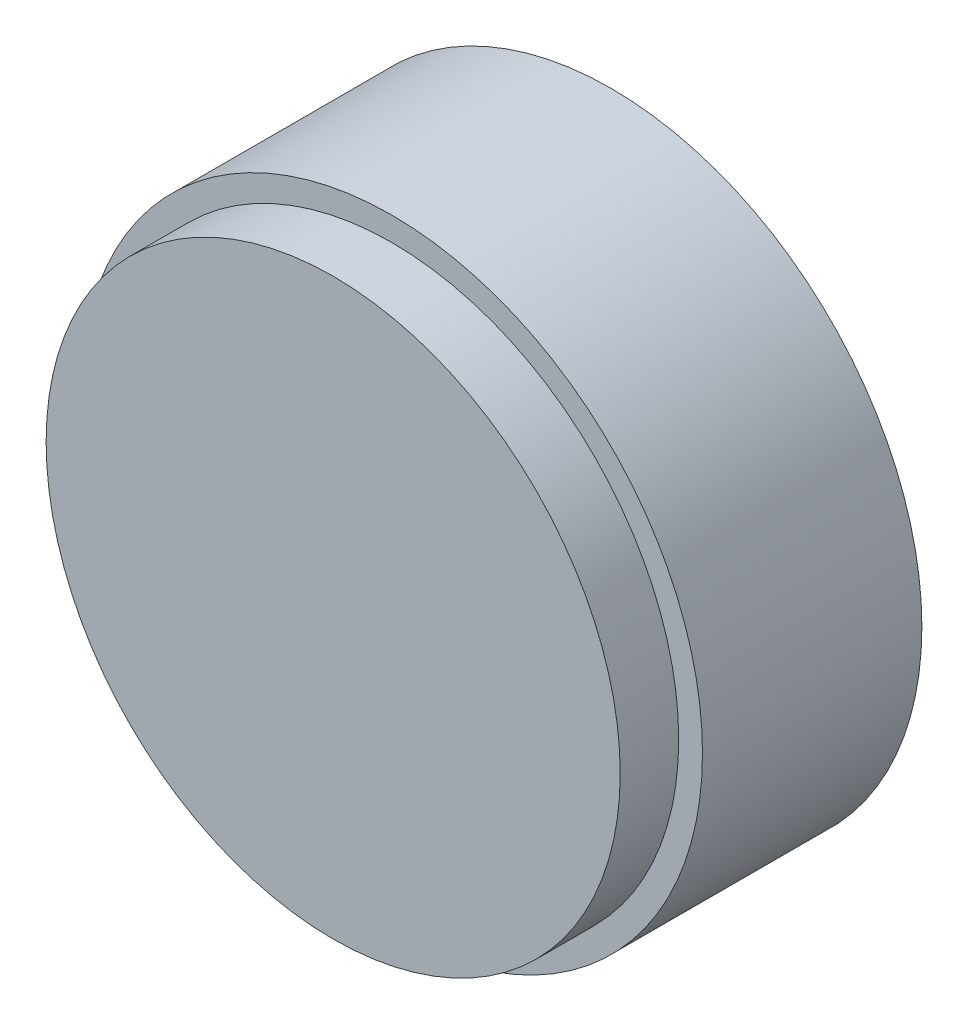
ISO-10303-21;
HEADER;
FILE_DESCRIPTION(('STEP AP214'),'2;1');
FILE_NAME('part.step','',(''),(''),'','','');
FILE_SCHEMA(('AUTOMOTIVE_DESIGN { 1 0 10303 214 1 1 1 1 }'));
ENDSEC;
DATA;
#1=APPLICATION_CONTEXT('core data for automotive mechanical design processes');
#2=APPLICATION_PROTOCOL_DEFINITION('international standard','automotive_design',2000,#1);
#3=PRODUCT_CONTEXT('',#1,'mechanical');
#4=PRODUCT('Part','Part','',(#3));
#5=PRODUCT_RELATED_PRODUCT_CATEGORY('part','',(#4));
#6=PRODUCT_DEFINITION_FORMATION('','',#4);
#7=PRODUCT_DEFINITION_CONTEXT('part definition',#1,'design');
#8=PRODUCT_DEFINITION('design','',#6,#7);
#9=PRODUCT_DEFINITION_SHAPE('','',#8);
#10=(LENGTH_UNIT() NAMED_UNIT(*) SI_UNIT(.MILLI.,.METRE.));
#11=(NAMED_UNIT(*) PLANE_ANGLE_UNIT() SI_UNIT($,.RADIAN.));
#12=(NAMED_UNIT(*) SI_UNIT($,.STERADIAN.) SOLID_ANGLE_UNIT());
#13=UNCERTAINTY_MEASURE_WITH_UNIT(LENGTH_MEASURE(1.E-05),#10,'distance_accuracy_value','');
#14=(GEOMETRIC_REPRESENTATION_CONTEXT(3) GLOBAL_UNCERTAINTY_ASSIGNED_CONTEXT((#13)) GLOBAL_UNIT_ASSIGNED_CONTEXT((#10,
#11,#12)) REPRESENTATION_CONTEXT('',''));
#15=CARTESIAN_POINT('',(0.,0.,0.));
#16=DIRECTION('',(0.,0.,1.));
#17=DIRECTION('',(1.,0.,0.));
#18=AXIS2_PLACEMENT_3D('',#15,#16,#17);
#19=CARTESIAN_POINT('',(-9.652E-05,-0.00011684,0.));
#20=DIRECTION('',(0.,0.,-1.));
#21=DIRECTION('',(1.,0.,0.));
#22=AXIS2_PLACEMENT_3D('',#19,#20,#21);
#23=CYLINDRICAL_SURFACE('',#22,8.50000078);
#24=CARTESIAN_POINT('',(-9.652E-05,-0.00011684,0.));
#25=DIRECTION('',(0.,0.,1.));
#26=DIRECTION('',(1.,0.,0.));
#27=AXIS2_PLACEMENT_3D('',#24,#25,#26);
#28=CIRCLE('',#27,8.50000078);
#29=CARTESIAN_POINT('',(8.49990426,-0.00011684,0.));
#30=VERTEX_POINT('',#29);
#31=EDGE_CURVE('P0_E11',#30,#30,#28,.T.);
#32=ORIENTED_EDGE('',*,*,#31,.T.);
#33=DIRECTION('',(0.,0.,1.));
#34=VECTOR('',#33,1.);
#35=CARTESIAN_POINT('',(8.49990426,-0.00011684,0.));
#36=LINE('',#35,#34);
#37=CARTESIAN_POINT('',(8.49990426,-0.00011684,6.0000007));
#38=VERTEX_POINT('',#37);
#39=EDGE_CURVE('P0_E23',#30,#38,#36,.T.);
#40=ORIENTED_EDGE('',*,*,#39,.T.);
#41=CARTESIAN_POINT('',(-9.652E-05,-0.00011684,6.0000007));
#42=DIRECTION('',(0.,0.,1.));
#43=DIRECTION('',(1.,0.,0.));
#44=AXIS2_PLACEMENT_3D('',#41,#42,#43);
#45=CIRCLE('',#44,8.50000078);
#46=EDGE_CURVE('P0_E31',#38,#38,#45,.T.);
#47=ORIENTED_EDGE('',*,*,#46,.F.);
#48=ORIENTED_EDGE('',*,*,#39,.F.);
#49=EDGE_LOOP('',(#32,#40,#47,#48));
#50=FACE_BOUND('',#49,.T.);
#51=ADVANCED_FACE('P0_F16',(#50),#23,.T.);
#52=CARTESIAN_POINT('',(8.49990426,-0.00011684,0.));
#53=DIRECTION('',(0.,0.,-1.));
#54=DIRECTION('',(-1.,0.,0.));
#55=AXIS2_PLACEMENT_3D('',#52,#53,#54);
#56=PLANE('',#55);
#57=ORIENTED_EDGE('',*,*,#31,.F.);
#58=EDGE_LOOP('',(#57));
#59=FACE_BOUND('',#58,.T.);
#60=ADVANCED_FACE('P0_F36',(#59),#56,.T.);
#61=CARTESIAN_POINT('',(8.49990426,-0.00011684,6.0000007));
#62=DIRECTION('',(0.,0.,-1.));
#63=DIRECTION('',(-1.,0.,0.));
#64=AXIS2_PLACEMENT_3D('',#61,#62,#63);
#65=PLANE('',#64);
#66=ORIENTED_EDGE('',*,*,#46,.T.);
#67=EDGE_LOOP('',(#66));
#68=FACE_BOUND('',#67,.T.);
#69=ADVANCED_FACE('P0_F33',(#68),#65,.F.);
#70=CLOSED_SHELL('',(#51,#60,#69));
#71=MANIFOLD_SOLID_BREP('P0_B1',#70);
#72=CARTESIAN_POINT('',(-0.00010414,-7.62E-05,0.));
#73=DIRECTION('',(0.,0.,-1.));
#74=DIRECTION('',(1.,0.,0.));
#75=AXIS2_PLACEMENT_3D('',#72,#73,#74);
#76=CYLINDRICAL_SURFACE('',#75,7.84999954);
#77=CARTESIAN_POINT('',(-0.00010414,-7.62E-05,0.));
#78=DIRECTION('',(0.,0.,1.));
#79=DIRECTION('',(1.,0.,0.));
#80=AXIS2_PLACEMENT_3D('',#77,#78,#79);
#81=CIRCLE('',#80,7.84999954);
#82=CARTESIAN_POINT('',(7.8498954,-7.62E-05,0.));
#83=VERTEX_POINT('',#82);
#84=EDGE_CURVE('P1_E11',#83,#83,#81,.T.);
#85=ORIENTED_EDGE('',*,*,#84,.T.);
#86=DIRECTION('',(0.,0.,1.));
#87=VECTOR('',#86,1.);
#88=CARTESIAN_POINT('',(7.8498954,-7.62E-05,0.));
#89=LINE('',#88,#87);
#90=CARTESIAN_POINT('',(7.8498954,-7.62E-05,7.60000004));
#91=VERTEX_POINT('',#90);
#92=EDGE_CURVE('P1_E23',#83,#91,#89,.T.);
#93=ORIENTED_EDGE('',*,*,#92,.T.);
#94=CARTESIAN_POINT('',(-0.00010414,-7.62E-05,7.60000004));
#95=DIRECTION('',(0.,0.,1.));
#96=DIRECTION('',(1.,0.,0.));
#97=AXIS2_PLACEMENT_3D('',#94,#95,#96);
#98=CIRCLE('',#97,7.84999954);
#99=EDGE_CURVE('P1_E31',#91,#91,#98,.T.);
#100=ORIENTED_EDGE('',*,*,#99,.F.);
#101=ORIENTED_EDGE('',*,*,#92,.F.);
#102=EDGE_LOOP('',(#85,#93,#100,#101));
#103=FACE_BOUND('',#102,.T.);
#104=ADVANCED_FACE('P1_F16',(#103),#76,.T.);
#105=CARTESIAN_POINT('',(7.8498954,-7.62E-05,0.));
#106=DIRECTION('',(0.,0.,-1.));
#107=DIRECTION('',(-1.,0.,0.));
#108=AXIS2_PLACEMENT_3D('',#105,#106,#107);
#109=PLANE('',#108);
#110=ORIENTED_EDGE('',*,*,#84,.F.);
#111=EDGE_LOOP('',(#110));
#112=FACE_BOUND('',#111,.T.);
#113=ADVANCED_FACE('P1_F36',(#112),#109,.T.);
#114=CARTESIAN_POINT('',(7.8498954,-7.62E-05,7.60000004));
#115=DIRECTION('',(0.,0.,-1.));
#116=DIRECTION('',(-1.,0.,0.));
#117=AXIS2_PLACEMENT_3D('',#114,#115,#116);
#118=PLANE('',#117);
#119=ORIENTED_EDGE('',*,*,#99,.T.);
#120=EDGE_LOOP('',(#119));
#121=FACE_BOUND('',#120,.T.);
#122=ADVANCED_FACE('P1_F33',(#121),#118,.F.);
#123=CLOSED_SHELL('',(#104,#113,#122));
#124=MANIFOLD_SOLID_BREP('P1_B1',#123);
#125=ADVANCED_BREP_SHAPE_REPRESENTATION('',(#18,#71,#124),#14);
#126=SHAPE_DEFINITION_REPRESENTATION(#9,#125);
ENDSEC;
END-ISO-10303-21;
